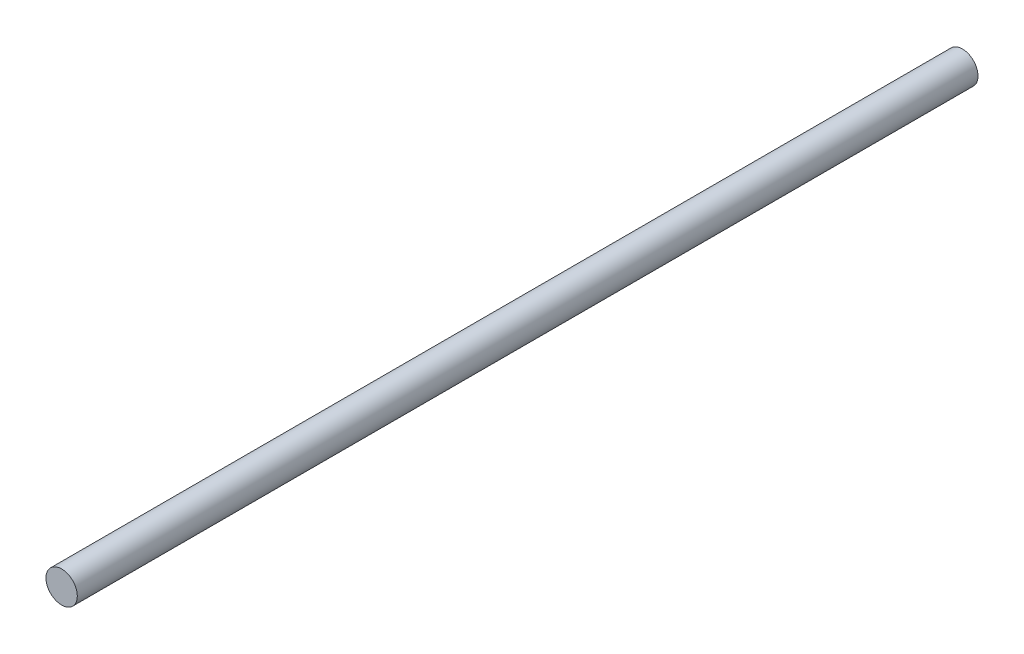
ISO-10303-21;
HEADER;
FILE_DESCRIPTION(('STEP AP214'),'2;1');
FILE_NAME('part.step','',(''),(''),'','','');
FILE_SCHEMA(('AUTOMOTIVE_DESIGN { 1 0 10303 214 1 1 1 1 }'));
ENDSEC;
DATA;
#1=APPLICATION_CONTEXT('core data for automotive mechanical design processes');
#2=APPLICATION_PROTOCOL_DEFINITION('international standard','automotive_design',2000,#1);
#3=PRODUCT_CONTEXT('',#1,'mechanical');
#4=PRODUCT('Part','Part','',(#3));
#5=PRODUCT_RELATED_PRODUCT_CATEGORY('part','',(#4));
#6=PRODUCT_DEFINITION_FORMATION('','',#4);
#7=PRODUCT_DEFINITION_CONTEXT('part definition',#1,'design');
#8=PRODUCT_DEFINITION('design','',#6,#7);
#9=PRODUCT_DEFINITION_SHAPE('','',#8);
#10=(LENGTH_UNIT() NAMED_UNIT(*) SI_UNIT(.MILLI.,.METRE.));
#11=(NAMED_UNIT(*) PLANE_ANGLE_UNIT() SI_UNIT($,.RADIAN.));
#12=(NAMED_UNIT(*) SI_UNIT($,.STERADIAN.) SOLID_ANGLE_UNIT());
#13=UNCERTAINTY_MEASURE_WITH_UNIT(LENGTH_MEASURE(1.E-05),#10,'distance_accuracy_value','');
#14=(GEOMETRIC_REPRESENTATION_CONTEXT(3) GLOBAL_UNCERTAINTY_ASSIGNED_CONTEXT((#13)) GLOBAL_UNIT_ASSIGNED_CONTEXT((#10,
#11,#12)) REPRESENTATION_CONTEXT('',''));
#15=CARTESIAN_POINT('',(0.,0.,0.));
#16=DIRECTION('',(0.,0.,1.));
#17=DIRECTION('',(1.,0.,0.));
#18=AXIS2_PLACEMENT_3D('',#15,#16,#17);
#19=CARTESIAN_POINT('',(0.,0.,23.));
#20=DIRECTION('',(0.,0.,-1.));
#21=DIRECTION('',(-1.,0.,0.));
#22=AXIS2_PLACEMENT_3D('',#19,#20,#21);
#23=CYLINDRICAL_SURFACE('',#22,0.4);
#24=CARTESIAN_POINT('',(0.,0.,23.));
#25=DIRECTION('',(0.,0.,1.));
#26=DIRECTION('',(1.,0.,0.));
#27=AXIS2_PLACEMENT_3D('',#24,#25,#26);
#28=CIRCLE('',#27,0.4);
#29=CARTESIAN_POINT('',(0.4,0.,23.));
#30=VERTEX_POINT('',#29);
#31=EDGE_CURVE('E10',#30,#30,#28,.T.);
#32=ORIENTED_EDGE('',*,*,#31,.F.);
#33=EDGE_LOOP('',(#32));
#34=FACE_BOUND('',#33,.T.);
#35=CARTESIAN_POINT('',(0.,0.,0.));
#36=DIRECTION('',(0.,0.,1.));
#37=DIRECTION('',(1.,0.,0.));
#38=AXIS2_PLACEMENT_3D('',#35,#36,#37);
#39=CIRCLE('',#38,0.4);
#40=CARTESIAN_POINT('',(0.4,0.,0.));
#41=VERTEX_POINT('',#40);
#42=EDGE_CURVE('E33',#41,#41,#39,.T.);
#43=ORIENTED_EDGE('',*,*,#42,.T.);
#44=EDGE_LOOP('',(#43));
#45=FACE_BOUND('',#44,.T.);
#46=ADVANCED_FACE('F30',(#34,#45),#23,.T.);
#47=CARTESIAN_POINT('',(0.,0.,23.));
#48=DIRECTION('',(0.,0.,1.));
#49=DIRECTION('',(1.,0.,0.));
#50=AXIS2_PLACEMENT_3D('',#47,#48,#49);
#51=PLANE('',#50);
#52=ORIENTED_EDGE('',*,*,#31,.T.);
#53=EDGE_LOOP('',(#52));
#54=FACE_BOUND('',#53,.T.);
#55=ADVANCED_FACE('F45',(#54),#51,.T.);
#56=CARTESIAN_POINT('',(0.,0.,0.));
#57=DIRECTION('',(0.,0.,1.));
#58=DIRECTION('',(1.,0.,0.));
#59=AXIS2_PLACEMENT_3D('',#56,#57,#58);
#60=PLANE('',#59);
#61=ORIENTED_EDGE('',*,*,#42,.F.);
#62=EDGE_LOOP('',(#61));
#63=FACE_BOUND('',#62,.T.);
#64=ADVANCED_FACE('F43',(#63),#60,.F.);
#65=CLOSED_SHELL('',(#46,#55,#64));
#66=MANIFOLD_SOLID_BREP('B2',#65);
#67=ADVANCED_BREP_SHAPE_REPRESENTATION('',(#18,#66),#14);
#68=SHAPE_DEFINITION_REPRESENTATION(#9,#67);
ENDSEC;
END-ISO-10303-21;
